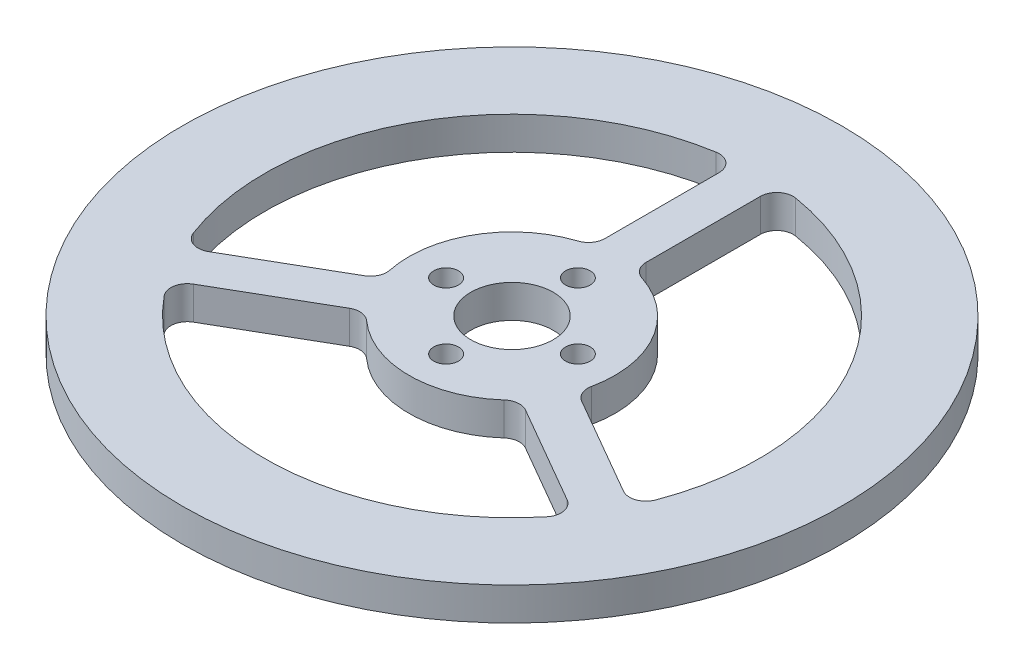
ISO-10303-21;
HEADER;
FILE_DESCRIPTION(('STEP AP214'),'2;1');
FILE_NAME('part.step','',(''),(''),'','','');
FILE_SCHEMA(('AUTOMOTIVE_DESIGN { 1 0 10303 214 1 1 1 1 }'));
ENDSEC;
DATA;
#1=APPLICATION_CONTEXT('core data for automotive mechanical design processes');
#2=APPLICATION_PROTOCOL_DEFINITION('international standard','automotive_design',2000,#1);
#3=PRODUCT_CONTEXT('',#1,'mechanical');
#4=PRODUCT('Part','Part','',(#3));
#5=PRODUCT_RELATED_PRODUCT_CATEGORY('part','',(#4));
#6=PRODUCT_DEFINITION_FORMATION('','',#4);
#7=PRODUCT_DEFINITION_CONTEXT('part definition',#1,'design');
#8=PRODUCT_DEFINITION('design','',#6,#7);
#9=PRODUCT_DEFINITION_SHAPE('','',#8);
#10=(LENGTH_UNIT() NAMED_UNIT(*) SI_UNIT(.MILLI.,.METRE.));
#11=(NAMED_UNIT(*) PLANE_ANGLE_UNIT() SI_UNIT($,.RADIAN.));
#12=(NAMED_UNIT(*) SI_UNIT($,.STERADIAN.) SOLID_ANGLE_UNIT());
#13=UNCERTAINTY_MEASURE_WITH_UNIT(LENGTH_MEASURE(1.E-05),#10,'distance_accuracy_value','');
#14=(GEOMETRIC_REPRESENTATION_CONTEXT(3) GLOBAL_UNCERTAINTY_ASSIGNED_CONTEXT((#13)) GLOBAL_UNIT_ASSIGNED_CONTEXT((#10,
#11,#12)) REPRESENTATION_CONTEXT('',''));
#15=CARTESIAN_POINT('',(0.,0.,0.));
#16=DIRECTION('',(0.,0.,1.));
#17=DIRECTION('',(1.,0.,0.));
#18=AXIS2_PLACEMENT_3D('',#15,#16,#17);
#19=CARTESIAN_POINT('',(0.,0.,0.));
#20=DIRECTION('',(0.,1.,0.));
#21=DIRECTION('',(0.,0.,1.));
#22=AXIS2_PLACEMENT_3D('',#19,#20,#21);
#23=CYLINDRICAL_SURFACE('',#22,40.);
#24=CARTESIAN_POINT('',(0.,0.,0.));
#25=DIRECTION('',(0.,1.,0.));
#26=DIRECTION('',(0.,0.,-1.));
#27=AXIS2_PLACEMENT_3D('',#24,#25,#26);
#28=CIRCLE('',#27,40.);
#29=CARTESIAN_POINT('',(0.,0.,-40.));
#30=VERTEX_POINT('',#29);
#31=EDGE_CURVE('E11',#30,#30,#28,.T.);
#32=ORIENTED_EDGE('',*,*,#31,.T.);
#33=EDGE_LOOP('',(#32));
#34=FACE_BOUND('',#33,.T.);
#35=CARTESIAN_POINT('',(0.,4.,0.));
#36=DIRECTION('',(0.,1.,0.));
#37=DIRECTION('',(0.,0.,-1.));
#38=AXIS2_PLACEMENT_3D('',#35,#36,#37);
#39=CIRCLE('',#38,40.);
#40=CARTESIAN_POINT('',(0.,4.,-40.));
#41=VERTEX_POINT('',#40);
#42=EDGE_CURVE('E40',#41,#41,#39,.T.);
#43=ORIENTED_EDGE('',*,*,#42,.F.);
#44=EDGE_LOOP('',(#43));
#45=FACE_BOUND('',#44,.T.);
#46=ADVANCED_FACE('F37',(#34,#45),#23,.T.);
#47=CARTESIAN_POINT('',(0.,0.,0.));
#48=DIRECTION('',(0.,-1.,0.));
#49=DIRECTION('',(0.,0.,-1.));
#50=AXIS2_PLACEMENT_3D('',#47,#48,#49);
#51=PLANE('',#50);
#52=CARTESIAN_POINT('',(9.68733638631333,0.,10.7891386930751));
#53=DIRECTION('',(0.,1.,0.));
#54=DIRECTION('',(0.,0.,-1.));
#55=AXIS2_PLACEMENT_3D('',#52,#53,#54);
#56=CIRCLE('',#55,2.00000000000001);
#57=CARTESIAN_POINT('',(10.6873363863133,0.,9.05708788550621));
#58=VERTEX_POINT('',#57);
#59=CARTESIAN_POINT('',(8.35115205716666,0.,9.30098163196128));
#60=VERTEX_POINT('',#59);
#61=EDGE_CURVE('E199',#58,#60,#56,.T.);
#62=ORIENTED_EDGE('',*,*,#61,.T.);
#63=CARTESIAN_POINT('',(0.,0.,0.));
#64=DIRECTION('',(0.,-1.,0.));
#65=DIRECTION('',(0.,0.,1.));
#66=AXIS2_PLACEMENT_3D('',#63,#64,#65);
#67=CIRCLE('',#66,12.5);
#68=CARTESIAN_POINT('',(-8.35115205716666,0.,9.30098163196128));
#69=VERTEX_POINT('',#68);
#70=EDGE_CURVE('E208',#60,#69,#67,.T.);
#71=ORIENTED_EDGE('',*,*,#70,.T.);
#72=CARTESIAN_POINT('',(-9.68733638631333,0.,10.7891386930751));
#73=DIRECTION('',(0.,1.,0.));
#74=DIRECTION('',(0.,0.,-1.));
#75=AXIS2_PLACEMENT_3D('',#72,#73,#74);
#76=CIRCLE('',#75,2.00000000000001);
#77=CARTESIAN_POINT('',(-10.6873363863133,0.,9.05708788550621));
#78=VERTEX_POINT('',#77);
#79=EDGE_CURVE('E51',#69,#78,#76,.T.);
#80=ORIENTED_EDGE('',*,*,#79,.T.);
#81=DIRECTION('',(-0.866025403784439,0.,0.499999999999999));
#82=VECTOR('',#81,1.);
#83=CARTESIAN_POINT('',(-22.6835016242922,0.,15.9830771148965));
#84=LINE('',#83,#82);
#85=CARTESIAN_POINT('',(-22.6835016242922,0.,15.9830771148966));
#86=VERTEX_POINT('',#85);
#87=EDGE_CURVE('E223',#78,#86,#84,.T.);
#88=ORIENTED_EDGE('',*,*,#87,.T.);
#89=CARTESIAN_POINT('',(-21.6835016242922,0.,17.7151279224655));
#90=DIRECTION('',(0.,1.,0.));
#91=DIRECTION('',(0.,0.,-1.));
#92=AXIS2_PLACEMENT_3D('',#89,#90,#91);
#93=CIRCLE('',#92,2.00000000000001);
#94=CARTESIAN_POINT('',(-23.2323231688846,0.,18.9804942026415));
#95=VERTEX_POINT('',#94);
#96=EDGE_CURVE('E226',#86,#95,#93,.T.);
#97=ORIENTED_EDGE('',*,*,#96,.T.);
#98=CARTESIAN_POINT('',(0.,0.,0.));
#99=DIRECTION('',(0.,1.,0.));
#100=DIRECTION('',(0.,0.,-1.));
#101=AXIS2_PLACEMENT_3D('',#98,#99,#100);
#102=CIRCLE('',#101,30.);
#103=CARTESIAN_POINT('',(23.2323231688846,0.,18.9804942026416));
#104=VERTEX_POINT('',#103);
#105=EDGE_CURVE('E229',#95,#104,#102,.T.);
#106=ORIENTED_EDGE('',*,*,#105,.T.);
#107=CARTESIAN_POINT('',(21.6835016242922,0.,17.7151279224655));
#108=DIRECTION('',(0.,1.,0.));
#109=DIRECTION('',(0.,0.,-1.));
#110=AXIS2_PLACEMENT_3D('',#107,#108,#109);
#111=CIRCLE('',#110,2.00000000000001);
#112=CARTESIAN_POINT('',(22.6835016242922,0.,15.9830771148965));
#113=VERTEX_POINT('',#112);
#114=EDGE_CURVE('E232',#104,#113,#111,.T.);
#115=ORIENTED_EDGE('',*,*,#114,.T.);
#116=DIRECTION('',(-0.866025403784439,0.,-0.499999999999999));
#117=VECTOR('',#116,1.);
#118=CARTESIAN_POINT('',(10.6873363863133,0.,9.05708788550621));
#119=LINE('',#118,#117);
#120=EDGE_CURVE('E205',#113,#58,#119,.T.);
#121=ORIENTED_EDGE('',*,*,#120,.T.);
#122=EDGE_LOOP('',(#62,#71,#80,#88,#97,#106,#115,#121));
#123=FACE_BOUND('',#122,.T.);
#124=CARTESIAN_POINT('',(26.1835016242922,0.,9.92089928840549));
#125=DIRECTION('',(0.,1.,0.));
#126=DIRECTION('',(0.,0.,-1.));
#127=AXIS2_PLACEMENT_3D('',#124,#125,#126);
#128=CIRCLE('',#127,1.99999999999998);
#129=CARTESIAN_POINT('',(25.1835016242923,0.,11.6529500959744));
#130=VERTEX_POINT('',#129);
#131=CARTESIAN_POINT('',(28.0537517403131,0.,10.629534951863));
#132=VERTEX_POINT('',#131);
#133=EDGE_CURVE('E266',#130,#132,#128,.T.);
#134=ORIENTED_EDGE('',*,*,#133,.T.);
#135=CARTESIAN_POINT('',(0.,0.,0.));
#136=DIRECTION('',(0.,1.,0.));
#137=DIRECTION('',(0.,0.,-1.));
#138=AXIS2_PLACEMENT_3D('',#135,#136,#137);
#139=CIRCLE('',#138,30.);
#140=CARTESIAN_POINT('',(4.82142857142857,0.,-29.6100291545046));
#141=VERTEX_POINT('',#140);
#142=EDGE_CURVE('E269',#132,#141,#139,.T.);
#143=ORIENTED_EDGE('',*,*,#142,.T.);
#144=CARTESIAN_POINT('',(4.5,0.,-27.6360272108709));
#145=DIRECTION('',(0.,1.,0.));
#146=DIRECTION('',(0.,0.,-1.));
#147=AXIS2_PLACEMENT_3D('',#144,#145,#146);
#148=CIRCLE('',#147,1.99999999999998);
#149=CARTESIAN_POINT('',(2.5,0.,-27.6360272108709));
#150=VERTEX_POINT('',#149);
#151=EDGE_CURVE('E273',#141,#150,#148,.T.);
#152=ORIENTED_EDGE('',*,*,#151,.T.);
#153=DIRECTION('',(0.,0.,1.));
#154=VECTOR('',#153,1.);
#155=CARTESIAN_POINT('',(2.5,0.,-13.7840487520902));
#156=LINE('',#155,#154);
#157=CARTESIAN_POINT('',(2.5,0.,-13.7840487520902));
#158=VERTEX_POINT('',#157);
#159=EDGE_CURVE('E276',#150,#158,#156,.T.);
#160=ORIENTED_EDGE('',*,*,#159,.T.);
#161=CARTESIAN_POINT('',(4.5,0.,-13.7840487520902));
#162=DIRECTION('',(0.,1.,0.));
#163=DIRECTION('',(0.,0.,-1.));
#164=AXIS2_PLACEMENT_3D('',#161,#162,#163);
#165=CIRCLE('',#164,2.);
#166=CARTESIAN_POINT('',(3.87931034482759,0.,-11.8828006483536));
#167=VERTEX_POINT('',#166);
#168=EDGE_CURVE('E279',#158,#167,#165,.T.);
#169=ORIENTED_EDGE('',*,*,#168,.T.);
#170=CARTESIAN_POINT('',(0.,0.,0.));
#171=DIRECTION('',(0.,-1.,0.));
#172=DIRECTION('',(0.,0.,1.));
#173=AXIS2_PLACEMENT_3D('',#170,#171,#172);
#174=CIRCLE('',#173,12.5);
#175=CARTESIAN_POINT('',(12.2304624019942,0.,2.58181901639236));
#176=VERTEX_POINT('',#175);
#177=EDGE_CURVE('E282',#167,#176,#174,.T.);
#178=ORIENTED_EDGE('',*,*,#177,.T.);
#179=CARTESIAN_POINT('',(14.1873363863133,0.,2.99491005901514));
#180=DIRECTION('',(0.,1.,0.));
#181=DIRECTION('',(0.,0.,-1.));
#182=AXIS2_PLACEMENT_3D('',#179,#180,#181);
#183=CIRCLE('',#182,2.);
#184=CARTESIAN_POINT('',(13.1873363863133,0.,4.72696086658402));
#185=VERTEX_POINT('',#184);
#186=EDGE_CURVE('E285',#176,#185,#183,.T.);
#187=ORIENTED_EDGE('',*,*,#186,.T.);
#188=DIRECTION('',(0.86602540378444,0.,0.499999999999998));
#189=VECTOR('',#188,1.);
#190=CARTESIAN_POINT('',(25.1835016242923,0.,11.6529500959744));
#191=LINE('',#190,#189);
#192=EDGE_CURVE('E288',#185,#130,#191,.T.);
#193=ORIENTED_EDGE('',*,*,#192,.T.);
#194=EDGE_LOOP('',(#134,#143,#152,#160,#169,#178,#187,#193));
#195=FACE_BOUND('',#194,.T.);
#196=CARTESIAN_POINT('',(-4.5,0.,-27.6360272108709));
#197=DIRECTION('',(0.,1.,0.));
#198=DIRECTION('',(0.,0.,-1.));
#199=AXIS2_PLACEMENT_3D('',#196,#197,#198);
#200=CIRCLE('',#199,1.99999999999998);
#201=CARTESIAN_POINT('',(-2.5,0.,-27.6360272108709));
#202=VERTEX_POINT('',#201);
#203=CARTESIAN_POINT('',(-4.82142857142857,0.,-29.6100291545046));
#204=VERTEX_POINT('',#203);
#205=EDGE_CURVE('E330',#202,#204,#200,.T.);
#206=ORIENTED_EDGE('',*,*,#205,.T.);
#207=CARTESIAN_POINT('',(0.,0.,0.));
#208=DIRECTION('',(0.,1.,0.));
#209=DIRECTION('',(0.,0.,-1.));
#210=AXIS2_PLACEMENT_3D('',#207,#208,#209);
#211=CIRCLE('',#210,30.);
#212=CARTESIAN_POINT('',(-28.0537517403131,0.,10.629534951863));
#213=VERTEX_POINT('',#212);
#214=EDGE_CURVE('E333',#204,#213,#211,.T.);
#215=ORIENTED_EDGE('',*,*,#214,.T.);
#216=CARTESIAN_POINT('',(-26.1835016242922,0.,9.92089928840549));
#217=DIRECTION('',(0.,1.,0.));
#218=DIRECTION('',(0.,0.,-1.));
#219=AXIS2_PLACEMENT_3D('',#216,#217,#218);
#220=CIRCLE('',#219,1.99999999999998);
#221=CARTESIAN_POINT('',(-25.1835016242923,0.,11.6529500959744));
#222=VERTEX_POINT('',#221);
#223=EDGE_CURVE('E337',#213,#222,#220,.T.);
#224=ORIENTED_EDGE('',*,*,#223,.T.);
#225=DIRECTION('',(0.86602540378444,0.,-0.499999999999998));
#226=VECTOR('',#225,1.);
#227=CARTESIAN_POINT('',(-13.1873363863133,0.,4.72696086658403));
#228=LINE('',#227,#226);
#229=CARTESIAN_POINT('',(-13.1873363863133,0.,4.72696086658402));
#230=VERTEX_POINT('',#229);
#231=EDGE_CURVE('E340',#222,#230,#228,.T.);
#232=ORIENTED_EDGE('',*,*,#231,.T.);
#233=CARTESIAN_POINT('',(-14.1873363863133,0.,2.99491005901514));
#234=DIRECTION('',(0.,1.,0.));
#235=DIRECTION('',(0.,0.,-1.));
#236=AXIS2_PLACEMENT_3D('',#233,#234,#235);
#237=CIRCLE('',#236,2.);
#238=CARTESIAN_POINT('',(-12.2304624019942,0.,2.58181901639236));
#239=VERTEX_POINT('',#238);
#240=EDGE_CURVE('E343',#230,#239,#237,.T.);
#241=ORIENTED_EDGE('',*,*,#240,.T.);
#242=CARTESIAN_POINT('',(0.,0.,0.));
#243=DIRECTION('',(0.,-1.,0.));
#244=DIRECTION('',(0.,0.,1.));
#245=AXIS2_PLACEMENT_3D('',#242,#243,#244);
#246=CIRCLE('',#245,12.5);
#247=CARTESIAN_POINT('',(-3.87931034482758,0.,-11.8828006483536));
#248=VERTEX_POINT('',#247);
#249=EDGE_CURVE('E346',#239,#248,#246,.T.);
#250=ORIENTED_EDGE('',*,*,#249,.T.);
#251=CARTESIAN_POINT('',(-4.5,0.,-13.7840487520902));
#252=DIRECTION('',(0.,1.,0.));
#253=DIRECTION('',(0.,0.,-1.));
#254=AXIS2_PLACEMENT_3D('',#251,#252,#253);
#255=CIRCLE('',#254,2.);
#256=CARTESIAN_POINT('',(-2.5,0.,-13.7840487520902));
#257=VERTEX_POINT('',#256);
#258=EDGE_CURVE('E349',#248,#257,#255,.T.);
#259=ORIENTED_EDGE('',*,*,#258,.T.);
#260=DIRECTION('',(0.,0.,-1.));
#261=VECTOR('',#260,1.);
#262=CARTESIAN_POINT('',(-2.5,0.,-27.6360272108709));
#263=LINE('',#262,#261);
#264=EDGE_CURVE('E352',#257,#202,#263,.T.);
#265=ORIENTED_EDGE('',*,*,#264,.T.);
#266=EDGE_LOOP('',(#206,#215,#224,#232,#241,#250,#259,#265));
#267=FACE_BOUND('',#266,.T.);
#268=CARTESIAN_POINT('',(0.,0.,0.));
#269=DIRECTION('',(0.,1.,0.));
#270=DIRECTION('',(0.,0.,-1.));
#271=AXIS2_PLACEMENT_3D('',#268,#269,#270);
#272=CIRCLE('',#271,5.);
#273=CARTESIAN_POINT('',(0.,0.,-5.));
#274=VERTEX_POINT('',#273);
#275=EDGE_CURVE('E394',#274,#274,#272,.T.);
#276=ORIENTED_EDGE('',*,*,#275,.T.);
#277=EDGE_LOOP('',(#276));
#278=FACE_BOUND('',#277,.T.);
#279=CARTESIAN_POINT('',(0.,0.,-8.));
#280=DIRECTION('',(0.,1.,0.));
#281=DIRECTION('',(0.,0.,-1.));
#282=AXIS2_PLACEMENT_3D('',#279,#280,#281);
#283=CIRCLE('',#282,1.5);
#284=CARTESIAN_POINT('',(0.,0.,-9.5));
#285=VERTEX_POINT('',#284);
#286=EDGE_CURVE('E400',#285,#285,#283,.T.);
#287=ORIENTED_EDGE('',*,*,#286,.T.);
#288=EDGE_LOOP('',(#287));
#289=FACE_BOUND('',#288,.T.);
#290=CARTESIAN_POINT('',(8.,0.,0.));
#291=DIRECTION('',(0.,1.,0.));
#292=DIRECTION('',(0.,0.,-1.));
#293=AXIS2_PLACEMENT_3D('',#290,#291,#292);
#294=CIRCLE('',#293,1.5);
#295=CARTESIAN_POINT('',(8.,0.,-1.5));
#296=VERTEX_POINT('',#295);
#297=EDGE_CURVE('E406',#296,#296,#294,.T.);
#298=ORIENTED_EDGE('',*,*,#297,.T.);
#299=EDGE_LOOP('',(#298));
#300=FACE_BOUND('',#299,.T.);
#301=CARTESIAN_POINT('',(0.,0.,8.));
#302=DIRECTION('',(0.,1.,0.));
#303=DIRECTION('',(0.,0.,-1.));
#304=AXIS2_PLACEMENT_3D('',#301,#302,#303);
#305=CIRCLE('',#304,1.5);
#306=CARTESIAN_POINT('',(0.,0.,6.5));
#307=VERTEX_POINT('',#306);
#308=EDGE_CURVE('E412',#307,#307,#305,.T.);
#309=ORIENTED_EDGE('',*,*,#308,.T.);
#310=EDGE_LOOP('',(#309));
#311=FACE_BOUND('',#310,.T.);
#312=CARTESIAN_POINT('',(-8.,0.,0.));
#313=DIRECTION('',(0.,1.,0.));
#314=DIRECTION('',(0.,0.,-1.));
#315=AXIS2_PLACEMENT_3D('',#312,#313,#314);
#316=CIRCLE('',#315,1.5);
#317=CARTESIAN_POINT('',(-8.,0.,-1.5));
#318=VERTEX_POINT('',#317);
#319=EDGE_CURVE('E418',#318,#318,#316,.T.);
#320=ORIENTED_EDGE('',*,*,#319,.T.);
#321=EDGE_LOOP('',(#320));
#322=FACE_BOUND('',#321,.T.);
#323=ORIENTED_EDGE('',*,*,#31,.F.);
#324=EDGE_LOOP('',(#323));
#325=FACE_BOUND('',#324,.T.);
#326=ADVANCED_FACE('F212',(#123,#195,#267,#278,#289,#300,#311,#322,#325),#51,.T.);
#327=CARTESIAN_POINT('',(0.,4.,0.));
#328=DIRECTION('',(0.,-1.,0.));
#329=DIRECTION('',(0.,0.,-1.));
#330=AXIS2_PLACEMENT_3D('',#327,#328,#329);
#331=PLANE('',#330);
#332=CARTESIAN_POINT('',(0.,4.,0.));
#333=DIRECTION('',(0.,-1.,0.));
#334=DIRECTION('',(0.,0.,1.));
#335=AXIS2_PLACEMENT_3D('',#332,#333,#334);
#336=CIRCLE('',#335,12.5);
#337=CARTESIAN_POINT('',(8.35115205716666,4.,9.30098163196128));
#338=VERTEX_POINT('',#337);
#339=CARTESIAN_POINT('',(-8.35115205716666,4.,9.30098163196128));
#340=VERTEX_POINT('',#339);
#341=EDGE_CURVE('E236',#338,#340,#336,.T.);
#342=ORIENTED_EDGE('',*,*,#341,.F.);
#343=CARTESIAN_POINT('',(9.68733638631333,4.,10.7891386930751));
#344=DIRECTION('',(0.,1.,0.));
#345=DIRECTION('',(0.,0.,-1.));
#346=AXIS2_PLACEMENT_3D('',#343,#344,#345);
#347=CIRCLE('',#346,2.00000000000001);
#348=CARTESIAN_POINT('',(10.6873363863133,4.,9.05708788550621));
#349=VERTEX_POINT('',#348);
#350=EDGE_CURVE('E59',#349,#338,#347,.T.);
#351=ORIENTED_EDGE('',*,*,#350,.F.);
#352=DIRECTION('',(-0.866025403784439,0.,-0.499999999999999));
#353=VECTOR('',#352,1.);
#354=CARTESIAN_POINT('',(10.6873363863133,4.,9.05708788550621));
#355=LINE('',#354,#353);
#356=CARTESIAN_POINT('',(22.6835016242922,4.,15.9830771148965));
#357=VERTEX_POINT('',#356);
#358=EDGE_CURVE('E216',#357,#349,#355,.T.);
#359=ORIENTED_EDGE('',*,*,#358,.F.);
#360=CARTESIAN_POINT('',(21.6835016242922,4.,17.7151279224655));
#361=DIRECTION('',(0.,1.,0.));
#362=DIRECTION('',(0.,0.,-1.));
#363=AXIS2_PLACEMENT_3D('',#360,#361,#362);
#364=CIRCLE('',#363,2.00000000000001);
#365=CARTESIAN_POINT('',(23.2323231688846,4.,18.9804942026416));
#366=VERTEX_POINT('',#365);
#367=EDGE_CURVE('E219',#366,#357,#364,.T.);
#368=ORIENTED_EDGE('',*,*,#367,.F.);
#369=CARTESIAN_POINT('',(0.,4.,0.));
#370=DIRECTION('',(0.,1.,0.));
#371=DIRECTION('',(0.,0.,-1.));
#372=AXIS2_PLACEMENT_3D('',#369,#370,#371);
#373=CIRCLE('',#372,30.);
#374=CARTESIAN_POINT('',(-23.2323231688846,4.,18.9804942026415));
#375=VERTEX_POINT('',#374);
#376=EDGE_CURVE('E247',#375,#366,#373,.T.);
#377=ORIENTED_EDGE('',*,*,#376,.F.);
#378=CARTESIAN_POINT('',(-21.6835016242922,4.,17.7151279224655));
#379=DIRECTION('',(0.,1.,0.));
#380=DIRECTION('',(0.,0.,-1.));
#381=AXIS2_PLACEMENT_3D('',#378,#379,#380);
#382=CIRCLE('',#381,2.00000000000001);
#383=CARTESIAN_POINT('',(-22.6835016242922,4.,15.9830771148966));
#384=VERTEX_POINT('',#383);
#385=EDGE_CURVE('E244',#384,#375,#382,.T.);
#386=ORIENTED_EDGE('',*,*,#385,.F.);
#387=DIRECTION('',(-0.866025403784439,0.,0.499999999999999));
#388=VECTOR('',#387,1.);
#389=CARTESIAN_POINT('',(-22.6835016242922,4.,15.9830771148965));
#390=LINE('',#389,#388);
#391=CARTESIAN_POINT('',(-10.6873363863133,4.,9.05708788550621));
#392=VERTEX_POINT('',#391);
#393=EDGE_CURVE('E241',#392,#384,#390,.T.);
#394=ORIENTED_EDGE('',*,*,#393,.F.);
#395=CARTESIAN_POINT('',(-9.68733638631333,4.,10.7891386930751));
#396=DIRECTION('',(0.,1.,0.));
#397=DIRECTION('',(0.,0.,-1.));
#398=AXIS2_PLACEMENT_3D('',#395,#396,#397);
#399=CIRCLE('',#398,2.00000000000001);
#400=EDGE_CURVE('E238',#340,#392,#399,.T.);
#401=ORIENTED_EDGE('',*,*,#400,.F.);
#402=EDGE_LOOP('',(#342,#351,#359,#368,#377,#386,#394,#401));
#403=FACE_BOUND('',#402,.T.);
#404=CARTESIAN_POINT('',(0.,4.,0.));
#405=DIRECTION('',(0.,1.,0.));
#406=DIRECTION('',(0.,0.,-1.));
#407=AXIS2_PLACEMENT_3D('',#404,#405,#406);
#408=CIRCLE('',#407,30.);
#409=CARTESIAN_POINT('',(28.0537517403131,4.,10.629534951863));
#410=VERTEX_POINT('',#409);
#411=CARTESIAN_POINT('',(4.82142857142857,4.,-29.6100291545046));
#412=VERTEX_POINT('',#411);
#413=EDGE_CURVE('E293',#410,#412,#408,.T.);
#414=ORIENTED_EDGE('',*,*,#413,.F.);
#415=CARTESIAN_POINT('',(26.1835016242922,4.,9.92089928840549));
#416=DIRECTION('',(0.,1.,0.));
#417=DIRECTION('',(0.,0.,-1.));
#418=AXIS2_PLACEMENT_3D('',#415,#416,#417);
#419=CIRCLE('',#418,1.99999999999998);
#420=CARTESIAN_POINT('',(25.1835016242923,4.,11.6529500959744));
#421=VERTEX_POINT('',#420);
#422=EDGE_CURVE('E254',#421,#410,#419,.T.);
#423=ORIENTED_EDGE('',*,*,#422,.F.);
#424=DIRECTION('',(0.86602540378444,0.,0.499999999999998));
#425=VECTOR('',#424,1.);
#426=CARTESIAN_POINT('',(25.1835016242923,4.,11.6529500959744));
#427=LINE('',#426,#425);
#428=CARTESIAN_POINT('',(13.1873363863133,4.,4.72696086658402));
#429=VERTEX_POINT('',#428);
#430=EDGE_CURVE('E270',#429,#421,#427,.T.);
#431=ORIENTED_EDGE('',*,*,#430,.F.);
#432=CARTESIAN_POINT('',(14.1873363863133,4.,2.99491005901514));
#433=DIRECTION('',(0.,1.,0.));
#434=DIRECTION('',(0.,0.,-1.));
#435=AXIS2_PLACEMENT_3D('',#432,#433,#434);
#436=CIRCLE('',#435,2.);
#437=CARTESIAN_POINT('',(12.2304624019942,4.,2.58181901639236));
#438=VERTEX_POINT('',#437);
#439=EDGE_CURVE('E308',#438,#429,#436,.T.);
#440=ORIENTED_EDGE('',*,*,#439,.F.);
#441=CARTESIAN_POINT('',(0.,4.,0.));
#442=DIRECTION('',(0.,-1.,0.));
#443=DIRECTION('',(0.,0.,1.));
#444=AXIS2_PLACEMENT_3D('',#441,#442,#443);
#445=CIRCLE('',#444,12.5);
#446=CARTESIAN_POINT('',(3.87931034482759,4.,-11.8828006483536));
#447=VERTEX_POINT('',#446);
#448=EDGE_CURVE('E305',#447,#438,#445,.T.);
#449=ORIENTED_EDGE('',*,*,#448,.F.);
#450=CARTESIAN_POINT('',(4.5,4.,-13.7840487520902));
#451=DIRECTION('',(0.,1.,0.));
#452=DIRECTION('',(0.,0.,-1.));
#453=AXIS2_PLACEMENT_3D('',#450,#451,#452);
#454=CIRCLE('',#453,2.);
#455=CARTESIAN_POINT('',(2.5,4.,-13.7840487520902));
#456=VERTEX_POINT('',#455);
#457=EDGE_CURVE('E302',#456,#447,#454,.T.);
#458=ORIENTED_EDGE('',*,*,#457,.F.);
#459=DIRECTION('',(0.,0.,1.));
#460=VECTOR('',#459,1.);
#461=CARTESIAN_POINT('',(2.5,4.,-13.7840487520902));
#462=LINE('',#461,#460);
#463=CARTESIAN_POINT('',(2.5,4.,-27.6360272108709));
#464=VERTEX_POINT('',#463);
#465=EDGE_CURVE('E299',#464,#456,#462,.T.);
#466=ORIENTED_EDGE('',*,*,#465,.F.);
#467=CARTESIAN_POINT('',(4.5,4.,-27.6360272108709));
#468=DIRECTION('',(0.,1.,0.));
#469=DIRECTION('',(0.,0.,-1.));
#470=AXIS2_PLACEMENT_3D('',#467,#468,#469);
#471=CIRCLE('',#470,1.99999999999998);
#472=EDGE_CURVE('E296',#412,#464,#471,.T.);
#473=ORIENTED_EDGE('',*,*,#472,.F.);
#474=EDGE_LOOP('',(#414,#423,#431,#440,#449,#458,#466,#473));
#475=FACE_BOUND('',#474,.T.);
#476=CARTESIAN_POINT('',(0.,4.,0.));
#477=DIRECTION('',(0.,1.,0.));
#478=DIRECTION('',(0.,0.,-1.));
#479=AXIS2_PLACEMENT_3D('',#476,#477,#478);
#480=CIRCLE('',#479,30.);
#481=CARTESIAN_POINT('',(-4.82142857142857,4.,-29.6100291545046));
#482=VERTEX_POINT('',#481);
#483=CARTESIAN_POINT('',(-28.0537517403131,4.,10.629534951863));
#484=VERTEX_POINT('',#483);
#485=EDGE_CURVE('E357',#482,#484,#480,.T.);
#486=ORIENTED_EDGE('',*,*,#485,.F.);
#487=CARTESIAN_POINT('',(-4.5,4.,-27.6360272108709));
#488=DIRECTION('',(0.,1.,0.));
#489=DIRECTION('',(0.,0.,-1.));
#490=AXIS2_PLACEMENT_3D('',#487,#488,#489);
#491=CIRCLE('',#490,1.99999999999998);
#492=CARTESIAN_POINT('',(-2.5,4.,-27.6360272108709));
#493=VERTEX_POINT('',#492);
#494=EDGE_CURVE('E315',#493,#482,#491,.T.);
#495=ORIENTED_EDGE('',*,*,#494,.F.);
#496=DIRECTION('',(0.,0.,-1.));
#497=VECTOR('',#496,1.);
#498=CARTESIAN_POINT('',(-2.5,4.,-27.6360272108709));
#499=LINE('',#498,#497);
#500=CARTESIAN_POINT('',(-2.5,4.,-13.7840487520902));
#501=VERTEX_POINT('',#500);
#502=EDGE_CURVE('E334',#501,#493,#499,.T.);
#503=ORIENTED_EDGE('',*,*,#502,.F.);
#504=CARTESIAN_POINT('',(-4.5,4.,-13.7840487520902));
#505=DIRECTION('',(0.,1.,0.));
#506=DIRECTION('',(0.,0.,-1.));
#507=AXIS2_PLACEMENT_3D('',#504,#505,#506);
#508=CIRCLE('',#507,2.);
#509=CARTESIAN_POINT('',(-3.87931034482758,4.,-11.8828006483536));
#510=VERTEX_POINT('',#509);
#511=EDGE_CURVE('E372',#510,#501,#508,.T.);
#512=ORIENTED_EDGE('',*,*,#511,.F.);
#513=CARTESIAN_POINT('',(0.,4.,0.));
#514=DIRECTION('',(0.,-1.,0.));
#515=DIRECTION('',(0.,0.,1.));
#516=AXIS2_PLACEMENT_3D('',#513,#514,#515);
#517=CIRCLE('',#516,12.5);
#518=CARTESIAN_POINT('',(-12.2304624019942,4.,2.58181901639236));
#519=VERTEX_POINT('',#518);
#520=EDGE_CURVE('E369',#519,#510,#517,.T.);
#521=ORIENTED_EDGE('',*,*,#520,.F.);
#522=CARTESIAN_POINT('',(-14.1873363863133,4.,2.99491005901514));
#523=DIRECTION('',(0.,1.,0.));
#524=DIRECTION('',(0.,0.,-1.));
#525=AXIS2_PLACEMENT_3D('',#522,#523,#524);
#526=CIRCLE('',#525,2.);
#527=CARTESIAN_POINT('',(-13.1873363863133,4.,4.72696086658402));
#528=VERTEX_POINT('',#527);
#529=EDGE_CURVE('E366',#528,#519,#526,.T.);
#530=ORIENTED_EDGE('',*,*,#529,.F.);
#531=DIRECTION('',(0.86602540378444,0.,-0.499999999999998));
#532=VECTOR('',#531,1.);
#533=CARTESIAN_POINT('',(-13.1873363863133,4.,4.72696086658403));
#534=LINE('',#533,#532);
#535=CARTESIAN_POINT('',(-25.1835016242923,4.,11.6529500959744));
#536=VERTEX_POINT('',#535);
#537=EDGE_CURVE('E363',#536,#528,#534,.T.);
#538=ORIENTED_EDGE('',*,*,#537,.F.);
#539=CARTESIAN_POINT('',(-26.1835016242922,4.,9.92089928840549));
#540=DIRECTION('',(0.,1.,0.));
#541=DIRECTION('',(0.,0.,-1.));
#542=AXIS2_PLACEMENT_3D('',#539,#540,#541);
#543=CIRCLE('',#542,1.99999999999998);
#544=EDGE_CURVE('E360',#484,#536,#543,.T.);
#545=ORIENTED_EDGE('',*,*,#544,.F.);
#546=EDGE_LOOP('',(#486,#495,#503,#512,#521,#530,#538,#545));
#547=FACE_BOUND('',#546,.T.);
#548=CARTESIAN_POINT('',(0.,4.,0.));
#549=DIRECTION('',(0.,1.,0.));
#550=DIRECTION('',(0.,0.,-1.));
#551=AXIS2_PLACEMENT_3D('',#548,#549,#550);
#552=CIRCLE('',#551,5.);
#553=CARTESIAN_POINT('',(0.,4.,-5.));
#554=VERTEX_POINT('',#553);
#555=EDGE_CURVE('E379',#554,#554,#552,.T.);
#556=ORIENTED_EDGE('',*,*,#555,.F.);
#557=EDGE_LOOP('',(#556));
#558=FACE_BOUND('',#557,.T.);
#559=CARTESIAN_POINT('',(0.,4.,-8.));
#560=DIRECTION('',(0.,1.,0.));
#561=DIRECTION('',(0.,0.,-1.));
#562=AXIS2_PLACEMENT_3D('',#559,#560,#561);
#563=CIRCLE('',#562,1.5);
#564=CARTESIAN_POINT('',(0.,4.,-9.5));
#565=VERTEX_POINT('',#564);
#566=EDGE_CURVE('E397',#565,#565,#563,.T.);
#567=ORIENTED_EDGE('',*,*,#566,.F.);
#568=EDGE_LOOP('',(#567));
#569=FACE_BOUND('',#568,.T.);
#570=CARTESIAN_POINT('',(8.,4.,0.));
#571=DIRECTION('',(0.,1.,0.));
#572=DIRECTION('',(0.,0.,-1.));
#573=AXIS2_PLACEMENT_3D('',#570,#571,#572);
#574=CIRCLE('',#573,1.5);
#575=CARTESIAN_POINT('',(8.,4.,-1.5));
#576=VERTEX_POINT('',#575);
#577=EDGE_CURVE('E403',#576,#576,#574,.T.);
#578=ORIENTED_EDGE('',*,*,#577,.F.);
#579=EDGE_LOOP('',(#578));
#580=FACE_BOUND('',#579,.T.);
#581=CARTESIAN_POINT('',(0.,4.,8.));
#582=DIRECTION('',(0.,1.,0.));
#583=DIRECTION('',(0.,0.,-1.));
#584=AXIS2_PLACEMENT_3D('',#581,#582,#583);
#585=CIRCLE('',#584,1.5);
#586=CARTESIAN_POINT('',(0.,4.,6.5));
#587=VERTEX_POINT('',#586);
#588=EDGE_CURVE('E409',#587,#587,#585,.T.);
#589=ORIENTED_EDGE('',*,*,#588,.F.);
#590=EDGE_LOOP('',(#589));
#591=FACE_BOUND('',#590,.T.);
#592=CARTESIAN_POINT('',(-8.,4.,0.));
#593=DIRECTION('',(0.,1.,0.));
#594=DIRECTION('',(0.,0.,-1.));
#595=AXIS2_PLACEMENT_3D('',#592,#593,#594);
#596=CIRCLE('',#595,1.5);
#597=CARTESIAN_POINT('',(-8.,4.,-1.5));
#598=VERTEX_POINT('',#597);
#599=EDGE_CURVE('E415',#598,#598,#596,.T.);
#600=ORIENTED_EDGE('',*,*,#599,.F.);
#601=EDGE_LOOP('',(#600));
#602=FACE_BOUND('',#601,.T.);
#603=ORIENTED_EDGE('',*,*,#42,.T.);
#604=EDGE_LOOP('',(#603));
#605=FACE_BOUND('',#604,.T.);
#606=ADVANCED_FACE('F426',(#403,#475,#547,#558,#569,#580,#591,#602,#605),#331,.F.);
#607=CARTESIAN_POINT('',(-8.,0.,0.));
#608=DIRECTION('',(0.,1.,0.));
#609=DIRECTION('',(0.,0.,1.));
#610=AXIS2_PLACEMENT_3D('',#607,#608,#609);
#611=CYLINDRICAL_SURFACE('',#610,1.5);
#612=ORIENTED_EDGE('',*,*,#319,.F.);
#613=EDGE_LOOP('',(#612));
#614=FACE_BOUND('',#613,.T.);
#615=ORIENTED_EDGE('',*,*,#599,.T.);
#616=EDGE_LOOP('',(#615));
#617=FACE_BOUND('',#616,.T.);
#618=ADVANCED_FACE('F424',(#614,#617),#611,.F.);
#619=CARTESIAN_POINT('',(0.,0.,8.));
#620=DIRECTION('',(0.,1.,0.));
#621=DIRECTION('',(0.,0.,1.));
#622=AXIS2_PLACEMENT_3D('',#619,#620,#621);
#623=CYLINDRICAL_SURFACE('',#622,1.5);
#624=ORIENTED_EDGE('',*,*,#308,.F.);
#625=EDGE_LOOP('',(#624));
#626=FACE_BOUND('',#625,.T.);
#627=ORIENTED_EDGE('',*,*,#588,.T.);
#628=EDGE_LOOP('',(#627));
#629=FACE_BOUND('',#628,.T.);
#630=ADVANCED_FACE('F446',(#626,#629),#623,.F.);
#631=CARTESIAN_POINT('',(8.,0.,0.));
#632=DIRECTION('',(0.,1.,0.));
#633=DIRECTION('',(0.,0.,1.));
#634=AXIS2_PLACEMENT_3D('',#631,#632,#633);
#635=CYLINDRICAL_SURFACE('',#634,1.5);
#636=ORIENTED_EDGE('',*,*,#297,.F.);
#637=EDGE_LOOP('',(#636));
#638=FACE_BOUND('',#637,.T.);
#639=ORIENTED_EDGE('',*,*,#577,.T.);
#640=EDGE_LOOP('',(#639));
#641=FACE_BOUND('',#640,.T.);
#642=ADVANCED_FACE('F450',(#638,#641),#635,.F.);
#643=CARTESIAN_POINT('',(0.,0.,-8.));
#644=DIRECTION('',(0.,1.,0.));
#645=DIRECTION('',(0.,0.,1.));
#646=AXIS2_PLACEMENT_3D('',#643,#644,#645);
#647=CYLINDRICAL_SURFACE('',#646,1.5);
#648=ORIENTED_EDGE('',*,*,#286,.F.);
#649=EDGE_LOOP('',(#648));
#650=FACE_BOUND('',#649,.T.);
#651=ORIENTED_EDGE('',*,*,#566,.T.);
#652=EDGE_LOOP('',(#651));
#653=FACE_BOUND('',#652,.T.);
#654=ADVANCED_FACE('F454',(#650,#653),#647,.F.);
#655=CARTESIAN_POINT('',(0.,0.,0.));
#656=DIRECTION('',(0.,1.,0.));
#657=DIRECTION('',(0.,0.,1.));
#658=AXIS2_PLACEMENT_3D('',#655,#656,#657);
#659=CYLINDRICAL_SURFACE('',#658,5.);
#660=ORIENTED_EDGE('',*,*,#275,.F.);
#661=EDGE_LOOP('',(#660));
#662=FACE_BOUND('',#661,.T.);
#663=ORIENTED_EDGE('',*,*,#555,.T.);
#664=EDGE_LOOP('',(#663));
#665=FACE_BOUND('',#664,.T.);
#666=ADVANCED_FACE('F458',(#662,#665),#659,.F.);
#667=CARTESIAN_POINT('',(-4.5,0.,-27.6360272108709));
#668=DIRECTION('',(0.,1.,0.));
#669=DIRECTION('',(0.,0.,1.));
#670=AXIS2_PLACEMENT_3D('',#667,#668,#669);
#671=CYLINDRICAL_SURFACE('',#670,1.99999999999998);
#672=ORIENTED_EDGE('',*,*,#494,.T.);
#673=DIRECTION('',(0.,1.,0.));
#674=VECTOR('',#673,1.);
#675=CARTESIAN_POINT('',(-4.82142857142857,0.,-29.6100291545046));
#676=LINE('',#675,#674);
#677=EDGE_CURVE('E355',#204,#482,#676,.T.);
#678=ORIENTED_EDGE('',*,*,#677,.F.);
#679=ORIENTED_EDGE('',*,*,#205,.F.);
#680=DIRECTION('',(0.,1.,0.));
#681=VECTOR('',#680,1.);
#682=CARTESIAN_POINT('',(-2.5,0.,-27.6360272108709));
#683=LINE('',#682,#681);
#684=EDGE_CURVE('E377',#202,#493,#683,.T.);
#685=ORIENTED_EDGE('',*,*,#684,.T.);
#686=EDGE_LOOP('',(#672,#678,#679,#685));
#687=FACE_BOUND('',#686,.T.);
#688=ADVANCED_FACE('F462',(#687),#671,.F.);
#689=CARTESIAN_POINT('',(-2.5,0.,-27.6360272108709));
#690=DIRECTION('',(1.,0.,0.));
#691=DIRECTION('',(0.,0.,-1.));
#692=AXIS2_PLACEMENT_3D('',#689,#690,#691);
#693=PLANE('',#692);
#694=ORIENTED_EDGE('',*,*,#502,.T.);
#695=ORIENTED_EDGE('',*,*,#684,.F.);
#696=ORIENTED_EDGE('',*,*,#264,.F.);
#697=DIRECTION('',(0.,1.,0.));
#698=VECTOR('',#697,1.);
#699=CARTESIAN_POINT('',(-2.5,0.,-13.7840487520902));
#700=LINE('',#699,#698);
#701=EDGE_CURVE('E380',#257,#501,#700,.T.);
#702=ORIENTED_EDGE('',*,*,#701,.T.);
#703=EDGE_LOOP('',(#694,#695,#696,#702));
#704=FACE_BOUND('',#703,.T.);
#705=ADVANCED_FACE('F466',(#704),#693,.F.);
#706=CARTESIAN_POINT('',(-4.5,0.,-13.7840487520902));
#707=DIRECTION('',(0.,1.,0.));
#708=DIRECTION('',(0.,0.,1.));
#709=AXIS2_PLACEMENT_3D('',#706,#707,#708);
#710=CYLINDRICAL_SURFACE('',#709,2.);
#711=ORIENTED_EDGE('',*,*,#511,.T.);
#712=ORIENTED_EDGE('',*,*,#701,.F.);
#713=ORIENTED_EDGE('',*,*,#258,.F.);
#714=DIRECTION('',(0.,1.,0.));
#715=VECTOR('',#714,1.);
#716=CARTESIAN_POINT('',(-3.87931034482758,0.,-11.8828006483536));
#717=LINE('',#716,#715);
#718=EDGE_CURVE('E382',#248,#510,#717,.T.);
#719=ORIENTED_EDGE('',*,*,#718,.T.);
#720=EDGE_LOOP('',(#711,#712,#713,#719));
#721=FACE_BOUND('',#720,.T.);
#722=ADVANCED_FACE('F488',(#721),#710,.F.);
#723=CARTESIAN_POINT('',(0.,0.,0.));
#724=DIRECTION('',(0.,1.,0.));
#725=DIRECTION('',(0.,0.,1.));
#726=AXIS2_PLACEMENT_3D('',#723,#724,#725);
#727=CYLINDRICAL_SURFACE('',#726,12.5);
#728=ORIENTED_EDGE('',*,*,#520,.T.);
#729=ORIENTED_EDGE('',*,*,#718,.F.);
#730=ORIENTED_EDGE('',*,*,#249,.F.);
#731=DIRECTION('',(0.,1.,0.));
#732=VECTOR('',#731,1.);
#733=CARTESIAN_POINT('',(-12.2304624019942,0.,2.58181901639236));
#734=LINE('',#733,#732);
#735=EDGE_CURVE('E384',#239,#519,#734,.T.);
#736=ORIENTED_EDGE('',*,*,#735,.T.);
#737=EDGE_LOOP('',(#728,#729,#730,#736));
#738=FACE_BOUND('',#737,.T.);
#739=ADVANCED_FACE('F484',(#738),#727,.T.);
#740=CARTESIAN_POINT('',(-14.1873363863133,0.,2.99491005901514));
#741=DIRECTION('',(0.,1.,0.));
#742=DIRECTION('',(0.,0.,1.));
#743=AXIS2_PLACEMENT_3D('',#740,#741,#742);
#744=CYLINDRICAL_SURFACE('',#743,2.);
#745=ORIENTED_EDGE('',*,*,#529,.T.);
#746=ORIENTED_EDGE('',*,*,#735,.F.);
#747=ORIENTED_EDGE('',*,*,#240,.F.);
#748=DIRECTION('',(0.,1.,0.));
#749=VECTOR('',#748,1.);
#750=CARTESIAN_POINT('',(-13.1873363863133,0.,4.72696086658402));
#751=LINE('',#750,#749);
#752=EDGE_CURVE('E386',#230,#528,#751,.T.);
#753=ORIENTED_EDGE('',*,*,#752,.T.);
#754=EDGE_LOOP('',(#745,#746,#747,#753));
#755=FACE_BOUND('',#754,.T.);
#756=ADVANCED_FACE('F480',(#755),#744,.F.);
#757=CARTESIAN_POINT('',(-13.1873363863133,0.,4.72696086658403));
#758=DIRECTION('',(0.499999999999998,0.,0.86602540378444));
#759=DIRECTION('',(0.86602540378444,0.,-0.499999999999998));
#760=AXIS2_PLACEMENT_3D('',#757,#758,#759);
#761=PLANE('',#760);
#762=ORIENTED_EDGE('',*,*,#537,.T.);
#763=ORIENTED_EDGE('',*,*,#752,.F.);
#764=ORIENTED_EDGE('',*,*,#231,.F.);
#765=DIRECTION('',(0.,1.,0.));
#766=VECTOR('',#765,1.);
#767=CARTESIAN_POINT('',(-25.1835016242923,0.,11.6529500959744));
#768=LINE('',#767,#766);
#769=EDGE_CURVE('E388',#222,#536,#768,.T.);
#770=ORIENTED_EDGE('',*,*,#769,.T.);
#771=EDGE_LOOP('',(#762,#763,#764,#770));
#772=FACE_BOUND('',#771,.T.);
#773=ADVANCED_FACE('F476',(#772),#761,.F.);
#774=CARTESIAN_POINT('',(-26.1835016242922,0.,9.92089928840549));
#775=DIRECTION('',(0.,1.,0.));
#776=DIRECTION('',(0.,0.,1.));
#777=AXIS2_PLACEMENT_3D('',#774,#775,#776);
#778=CYLINDRICAL_SURFACE('',#777,1.99999999999998);
#779=ORIENTED_EDGE('',*,*,#544,.T.);
#780=ORIENTED_EDGE('',*,*,#769,.F.);
#781=ORIENTED_EDGE('',*,*,#223,.F.);
#782=DIRECTION('',(0.,1.,0.));
#783=VECTOR('',#782,1.);
#784=CARTESIAN_POINT('',(-28.0537517403131,0.,10.629534951863));
#785=LINE('',#784,#783);
#786=EDGE_CURVE('E390',#213,#484,#785,.T.);
#787=ORIENTED_EDGE('',*,*,#786,.T.);
#788=EDGE_LOOP('',(#779,#780,#781,#787));
#789=FACE_BOUND('',#788,.T.);
#790=ADVANCED_FACE('F472',(#789),#778,.F.);
#791=CARTESIAN_POINT('',(0.,0.,0.));
#792=DIRECTION('',(0.,1.,0.));
#793=DIRECTION('',(0.,0.,1.));
#794=AXIS2_PLACEMENT_3D('',#791,#792,#793);
#795=CYLINDRICAL_SURFACE('',#794,30.);
#796=ORIENTED_EDGE('',*,*,#485,.T.);
#797=ORIENTED_EDGE('',*,*,#786,.F.);
#798=ORIENTED_EDGE('',*,*,#214,.F.);
#799=ORIENTED_EDGE('',*,*,#677,.T.);
#800=EDGE_LOOP('',(#796,#797,#798,#799));
#801=FACE_BOUND('',#800,.T.);
#802=ADVANCED_FACE('F468',(#801),#795,.F.);
#803=CARTESIAN_POINT('',(26.1835016242922,0.,9.92089928840549));
#804=DIRECTION('',(0.,1.,0.));
#805=DIRECTION('',(0.,0.,1.));
#806=AXIS2_PLACEMENT_3D('',#803,#804,#805);
#807=CYLINDRICAL_SURFACE('',#806,1.99999999999998);
#808=ORIENTED_EDGE('',*,*,#422,.T.);
#809=DIRECTION('',(0.,1.,0.));
#810=VECTOR('',#809,1.);
#811=CARTESIAN_POINT('',(28.0537517403131,0.,10.629534951863));
#812=LINE('',#811,#810);
#813=EDGE_CURVE('E291',#132,#410,#812,.T.);
#814=ORIENTED_EDGE('',*,*,#813,.F.);
#815=ORIENTED_EDGE('',*,*,#133,.F.);
#816=DIRECTION('',(0.,1.,0.));
#817=VECTOR('',#816,1.);
#818=CARTESIAN_POINT('',(25.1835016242923,0.,11.6529500959744));
#819=LINE('',#818,#817);
#820=EDGE_CURVE('E313',#130,#421,#819,.T.);
#821=ORIENTED_EDGE('',*,*,#820,.T.);
#822=EDGE_LOOP('',(#808,#814,#815,#821));
#823=FACE_BOUND('',#822,.T.);
#824=ADVANCED_FACE('F471',(#823),#807,.F.);
#825=CARTESIAN_POINT('',(25.1835016242923,0.,11.6529500959744));
#826=DIRECTION('',(-0.499999999999998,0.,0.86602540378444));
#827=DIRECTION('',(0.86602540378444,0.,0.499999999999998));
#828=AXIS2_PLACEMENT_3D('',#825,#826,#827);
#829=PLANE('',#828);
#830=ORIENTED_EDGE('',*,*,#430,.T.);
#831=ORIENTED_EDGE('',*,*,#820,.F.);
#832=ORIENTED_EDGE('',*,*,#192,.F.);
#833=DIRECTION('',(0.,1.,0.));
#834=VECTOR('',#833,1.);
#835=CARTESIAN_POINT('',(13.1873363863133,0.,4.72696086658402));
#836=LINE('',#835,#834);
#837=EDGE_CURVE('E316',#185,#429,#836,.T.);
#838=ORIENTED_EDGE('',*,*,#837,.T.);
#839=EDGE_LOOP('',(#830,#831,#832,#838));
#840=FACE_BOUND('',#839,.T.);
#841=ADVANCED_FACE('F498',(#840),#829,.F.);
#842=CARTESIAN_POINT('',(14.1873363863133,0.,2.99491005901514));
#843=DIRECTION('',(0.,1.,0.));
#844=DIRECTION('',(0.,0.,1.));
#845=AXIS2_PLACEMENT_3D('',#842,#843,#844);
#846=CYLINDRICAL_SURFACE('',#845,2.);
#847=ORIENTED_EDGE('',*,*,#439,.T.);
#848=ORIENTED_EDGE('',*,*,#837,.F.);
#849=ORIENTED_EDGE('',*,*,#186,.F.);
#850=DIRECTION('',(0.,1.,0.));
#851=VECTOR('',#850,1.);
#852=CARTESIAN_POINT('',(12.2304624019942,0.,2.58181901639236));
#853=LINE('',#852,#851);
#854=EDGE_CURVE('E318',#176,#438,#853,.T.);
#855=ORIENTED_EDGE('',*,*,#854,.T.);
#856=EDGE_LOOP('',(#847,#848,#849,#855));
#857=FACE_BOUND('',#856,.T.);
#858=ADVANCED_FACE('F519',(#857),#846,.F.);
#859=CARTESIAN_POINT('',(0.,0.,0.));
#860=DIRECTION('',(0.,1.,0.));
#861=DIRECTION('',(0.,0.,1.));
#862=AXIS2_PLACEMENT_3D('',#859,#860,#861);
#863=CYLINDRICAL_SURFACE('',#862,12.5);
#864=ORIENTED_EDGE('',*,*,#448,.T.);
#865=ORIENTED_EDGE('',*,*,#854,.F.);
#866=ORIENTED_EDGE('',*,*,#177,.F.);
#867=DIRECTION('',(0.,1.,0.));
#868=VECTOR('',#867,1.);
#869=CARTESIAN_POINT('',(3.87931034482759,0.,-11.8828006483536));
#870=LINE('',#869,#868);
#871=EDGE_CURVE('E320',#167,#447,#870,.T.);
#872=ORIENTED_EDGE('',*,*,#871,.T.);
#873=EDGE_LOOP('',(#864,#865,#866,#872));
#874=FACE_BOUND('',#873,.T.);
#875=ADVANCED_FACE('F515',(#874),#863,.T.);
#876=CARTESIAN_POINT('',(4.5,0.,-13.7840487520902));
#877=DIRECTION('',(0.,1.,0.));
#878=DIRECTION('',(0.,0.,1.));
#879=AXIS2_PLACEMENT_3D('',#876,#877,#878);
#880=CYLINDRICAL_SURFACE('',#879,2.);
#881=ORIENTED_EDGE('',*,*,#457,.T.);
#882=ORIENTED_EDGE('',*,*,#871,.F.);
#883=ORIENTED_EDGE('',*,*,#168,.F.);
#884=DIRECTION('',(0.,1.,0.));
#885=VECTOR('',#884,1.);
#886=CARTESIAN_POINT('',(2.5,0.,-13.7840487520902));
#887=LINE('',#886,#885);
#888=EDGE_CURVE('E322',#158,#456,#887,.T.);
#889=ORIENTED_EDGE('',*,*,#888,.T.);
#890=EDGE_LOOP('',(#881,#882,#883,#889));
#891=FACE_BOUND('',#890,.T.);
#892=ADVANCED_FACE('F511',(#891),#880,.F.);
#893=CARTESIAN_POINT('',(2.5,0.,-13.7840487520902));
#894=DIRECTION('',(-1.,0.,0.));
#895=DIRECTION('',(0.,0.,1.));
#896=AXIS2_PLACEMENT_3D('',#893,#894,#895);
#897=PLANE('',#896);
#898=ORIENTED_EDGE('',*,*,#465,.T.);
#899=ORIENTED_EDGE('',*,*,#888,.F.);
#900=ORIENTED_EDGE('',*,*,#159,.F.);
#901=DIRECTION('',(0.,1.,0.));
#902=VECTOR('',#901,1.);
#903=CARTESIAN_POINT('',(2.5,0.,-27.6360272108709));
#904=LINE('',#903,#902);
#905=EDGE_CURVE('E324',#150,#464,#904,.T.);
#906=ORIENTED_EDGE('',*,*,#905,.T.);
#907=EDGE_LOOP('',(#898,#899,#900,#906));
#908=FACE_BOUND('',#907,.T.);
#909=ADVANCED_FACE('F507',(#908),#897,.F.);
#910=CARTESIAN_POINT('',(4.5,0.,-27.6360272108709));
#911=DIRECTION('',(0.,1.,0.));
#912=DIRECTION('',(0.,0.,1.));
#913=AXIS2_PLACEMENT_3D('',#910,#911,#912);
#914=CYLINDRICAL_SURFACE('',#913,1.99999999999998);
#915=ORIENTED_EDGE('',*,*,#472,.T.);
#916=ORIENTED_EDGE('',*,*,#905,.F.);
#917=ORIENTED_EDGE('',*,*,#151,.F.);
#918=DIRECTION('',(0.,1.,0.));
#919=VECTOR('',#918,1.);
#920=CARTESIAN_POINT('',(4.82142857142857,0.,-29.6100291545046));
#921=LINE('',#920,#919);
#922=EDGE_CURVE('E326',#141,#412,#921,.T.);
#923=ORIENTED_EDGE('',*,*,#922,.T.);
#924=EDGE_LOOP('',(#915,#916,#917,#923));
#925=FACE_BOUND('',#924,.T.);
#926=ADVANCED_FACE('F503',(#925),#914,.F.);
#927=CARTESIAN_POINT('',(0.,0.,0.));
#928=DIRECTION('',(0.,1.,0.));
#929=DIRECTION('',(0.,0.,1.));
#930=AXIS2_PLACEMENT_3D('',#927,#928,#929);
#931=CYLINDRICAL_SURFACE('',#930,30.);
#932=ORIENTED_EDGE('',*,*,#413,.T.);
#933=ORIENTED_EDGE('',*,*,#922,.F.);
#934=ORIENTED_EDGE('',*,*,#142,.F.);
#935=ORIENTED_EDGE('',*,*,#813,.T.);
#936=EDGE_LOOP('',(#932,#933,#934,#935));
#937=FACE_BOUND('',#936,.T.);
#938=ADVANCED_FACE('F500',(#937),#931,.F.);
#939=CARTESIAN_POINT('',(9.68733638631333,0.,10.7891386930751));
#940=DIRECTION('',(0.,1.,0.));
#941=DIRECTION('',(0.,0.,1.));
#942=AXIS2_PLACEMENT_3D('',#939,#940,#941);
#943=CYLINDRICAL_SURFACE('',#942,2.00000000000001);
#944=ORIENTED_EDGE('',*,*,#350,.T.);
#945=DIRECTION('',(0.,1.,0.));
#946=VECTOR('',#945,1.);
#947=CARTESIAN_POINT('',(8.35115205716666,0.,9.30098163196128));
#948=LINE('',#947,#946);
#949=EDGE_CURVE('E195',#60,#338,#948,.T.);
#950=ORIENTED_EDGE('',*,*,#949,.F.);
#951=ORIENTED_EDGE('',*,*,#61,.F.);
#952=DIRECTION('',(0.,1.,0.));
#953=VECTOR('',#952,1.);
#954=CARTESIAN_POINT('',(10.6873363863133,0.,9.05708788550621));
#955=LINE('',#954,#953);
#956=EDGE_CURVE('E252',#58,#349,#955,.T.);
#957=ORIENTED_EDGE('',*,*,#956,.T.);
#958=EDGE_LOOP('',(#944,#950,#951,#957));
#959=FACE_BOUND('',#958,.T.);
#960=ADVANCED_FACE('F197',(#959),#943,.F.);
#961=CARTESIAN_POINT('',(10.6873363863133,0.,9.05708788550621));
#962=DIRECTION('',(0.499999999999999,0.,-0.86602540378444));
#963=DIRECTION('',(-0.86602540378444,0.,-0.499999999999999));
#964=AXIS2_PLACEMENT_3D('',#961,#962,#963);
#965=PLANE('',#964);
#966=ORIENTED_EDGE('',*,*,#358,.T.);
#967=ORIENTED_EDGE('',*,*,#956,.F.);
#968=ORIENTED_EDGE('',*,*,#120,.F.);
#969=DIRECTION('',(0.,1.,0.));
#970=VECTOR('',#969,1.);
#971=CARTESIAN_POINT('',(22.6835016242922,0.,15.9830771148965));
#972=LINE('',#971,#970);
#973=EDGE_CURVE('E255',#113,#357,#972,.T.);
#974=ORIENTED_EDGE('',*,*,#973,.T.);
#975=EDGE_LOOP('',(#966,#967,#968,#974));
#976=FACE_BOUND('',#975,.T.);
#977=ADVANCED_FACE('F529',(#976),#965,.F.);
#978=CARTESIAN_POINT('',(21.6835016242922,0.,17.7151279224655));
#979=DIRECTION('',(0.,1.,0.));
#980=DIRECTION('',(0.,0.,1.));
#981=AXIS2_PLACEMENT_3D('',#978,#979,#980);
#982=CYLINDRICAL_SURFACE('',#981,2.00000000000001);
#983=ORIENTED_EDGE('',*,*,#367,.T.);
#984=ORIENTED_EDGE('',*,*,#973,.F.);
#985=ORIENTED_EDGE('',*,*,#114,.F.);
#986=DIRECTION('',(0.,1.,0.));
#987=VECTOR('',#986,1.);
#988=CARTESIAN_POINT('',(23.2323231688846,0.,18.9804942026416));
#989=LINE('',#988,#987);
#990=EDGE_CURVE('E257',#104,#366,#989,.T.);
#991=ORIENTED_EDGE('',*,*,#990,.T.);
#992=EDGE_LOOP('',(#983,#984,#985,#991));
#993=FACE_BOUND('',#992,.T.);
#994=ADVANCED_FACE('F546',(#993),#982,.F.);
#995=CARTESIAN_POINT('',(0.,0.,0.));
#996=DIRECTION('',(0.,1.,0.));
#997=DIRECTION('',(0.,0.,1.));
#998=AXIS2_PLACEMENT_3D('',#995,#996,#997);
#999=CYLINDRICAL_SURFACE('',#998,30.);
#1000=ORIENTED_EDGE('',*,*,#376,.T.);
#1001=ORIENTED_EDGE('',*,*,#990,.F.);
#1002=ORIENTED_EDGE('',*,*,#105,.F.);
#1003=DIRECTION('',(0.,1.,0.));
#1004=VECTOR('',#1003,1.);
#1005=CARTESIAN_POINT('',(-23.2323231688846,0.,18.9804942026415));
#1006=LINE('',#1005,#1004);
#1007=EDGE_CURVE('E259',#95,#375,#1006,.T.);
#1008=ORIENTED_EDGE('',*,*,#1007,.T.);
#1009=EDGE_LOOP('',(#1000,#1001,#1002,#1008));
#1010=FACE_BOUND('',#1009,.T.);
#1011=ADVANCED_FACE('F542',(#1010),#999,.F.);
#1012=CARTESIAN_POINT('',(-21.6835016242922,0.,17.7151279224655));
#1013=DIRECTION('',(0.,1.,0.));
#1014=DIRECTION('',(0.,0.,1.));
#1015=AXIS2_PLACEMENT_3D('',#1012,#1013,#1014);
#1016=CYLINDRICAL_SURFACE('',#1015,2.00000000000001);
#1017=ORIENTED_EDGE('',*,*,#385,.T.);
#1018=ORIENTED_EDGE('',*,*,#1007,.F.);
#1019=ORIENTED_EDGE('',*,*,#96,.F.);
#1020=DIRECTION('',(0.,1.,0.));
#1021=VECTOR('',#1020,1.);
#1022=CARTESIAN_POINT('',(-22.6835016242922,0.,15.9830771148966));
#1023=LINE('',#1022,#1021);
#1024=EDGE_CURVE('E261',#86,#384,#1023,.T.);
#1025=ORIENTED_EDGE('',*,*,#1024,.T.);
#1026=EDGE_LOOP('',(#1017,#1018,#1019,#1025));
#1027=FACE_BOUND('',#1026,.T.);
#1028=ADVANCED_FACE('F538',(#1027),#1016,.F.);
#1029=CARTESIAN_POINT('',(-22.6835016242922,0.,15.9830771148965));
#1030=DIRECTION('',(-0.499999999999999,0.,-0.86602540378444));
#1031=DIRECTION('',(-0.86602540378444,0.,0.499999999999999));
#1032=AXIS2_PLACEMENT_3D('',#1029,#1030,#1031);
#1033=PLANE('',#1032);
#1034=ORIENTED_EDGE('',*,*,#393,.T.);
#1035=ORIENTED_EDGE('',*,*,#1024,.F.);
#1036=ORIENTED_EDGE('',*,*,#87,.F.);
#1037=DIRECTION('',(0.,1.,0.));
#1038=VECTOR('',#1037,1.);
#1039=CARTESIAN_POINT('',(-10.6873363863133,0.,9.05708788550621));
#1040=LINE('',#1039,#1038);
#1041=EDGE_CURVE('E263',#78,#392,#1040,.T.);
#1042=ORIENTED_EDGE('',*,*,#1041,.T.);
#1043=EDGE_LOOP('',(#1034,#1035,#1036,#1042));
#1044=FACE_BOUND('',#1043,.T.);
#1045=ADVANCED_FACE('F535',(#1044),#1033,.F.);
#1046=CARTESIAN_POINT('',(-9.68733638631333,0.,10.7891386930751));
#1047=DIRECTION('',(0.,1.,0.));
#1048=DIRECTION('',(0.,0.,1.));
#1049=AXIS2_PLACEMENT_3D('',#1046,#1047,#1048);
#1050=CYLINDRICAL_SURFACE('',#1049,2.00000000000001);
#1051=ORIENTED_EDGE('',*,*,#400,.T.);
#1052=ORIENTED_EDGE('',*,*,#1041,.F.);
#1053=ORIENTED_EDGE('',*,*,#79,.F.);
#1054=DIRECTION('',(0.,1.,0.));
#1055=VECTOR('',#1054,1.);
#1056=CARTESIAN_POINT('',(-8.35115205716666,0.,9.30098163196128));
#1057=LINE('',#1056,#1055);
#1058=EDGE_CURVE('E204',#69,#340,#1057,.T.);
#1059=ORIENTED_EDGE('',*,*,#1058,.T.);
#1060=EDGE_LOOP('',(#1051,#1052,#1053,#1059));
#1061=FACE_BOUND('',#1060,.T.);
#1062=ADVANCED_FACE('F532',(#1061),#1050,.F.);
#1063=CARTESIAN_POINT('',(0.,0.,0.));
#1064=DIRECTION('',(0.,1.,0.));
#1065=DIRECTION('',(0.,0.,1.));
#1066=AXIS2_PLACEMENT_3D('',#1063,#1064,#1065);
#1067=CYLINDRICAL_SURFACE('',#1066,12.5);
#1068=ORIENTED_EDGE('',*,*,#341,.T.);
#1069=ORIENTED_EDGE('',*,*,#1058,.F.);
#1070=ORIENTED_EDGE('',*,*,#70,.F.);
#1071=ORIENTED_EDGE('',*,*,#949,.T.);
#1072=EDGE_LOOP('',(#1068,#1069,#1070,#1071));
#1073=FACE_BOUND('',#1072,.T.);
#1074=ADVANCED_FACE('F209',(#1073),#1067,.T.);
#1075=CLOSED_SHELL('',(#46,#326,#606,#618,#630,#642,#654,#666,#688,#705,#722,#739,#756,#773,
#790,#802,#824,#841,#858,#875,#892,#909,#926,#938,#960,#977,#994,#1011,#1028,#1045,#1062,#1074));
#1076=MANIFOLD_SOLID_BREP('B2',#1075);
#1077=ADVANCED_BREP_SHAPE_REPRESENTATION('',(#18,#1076),#14);
#1078=SHAPE_DEFINITION_REPRESENTATION(#9,#1077);
ENDSEC;
END-ISO-10303-21;
